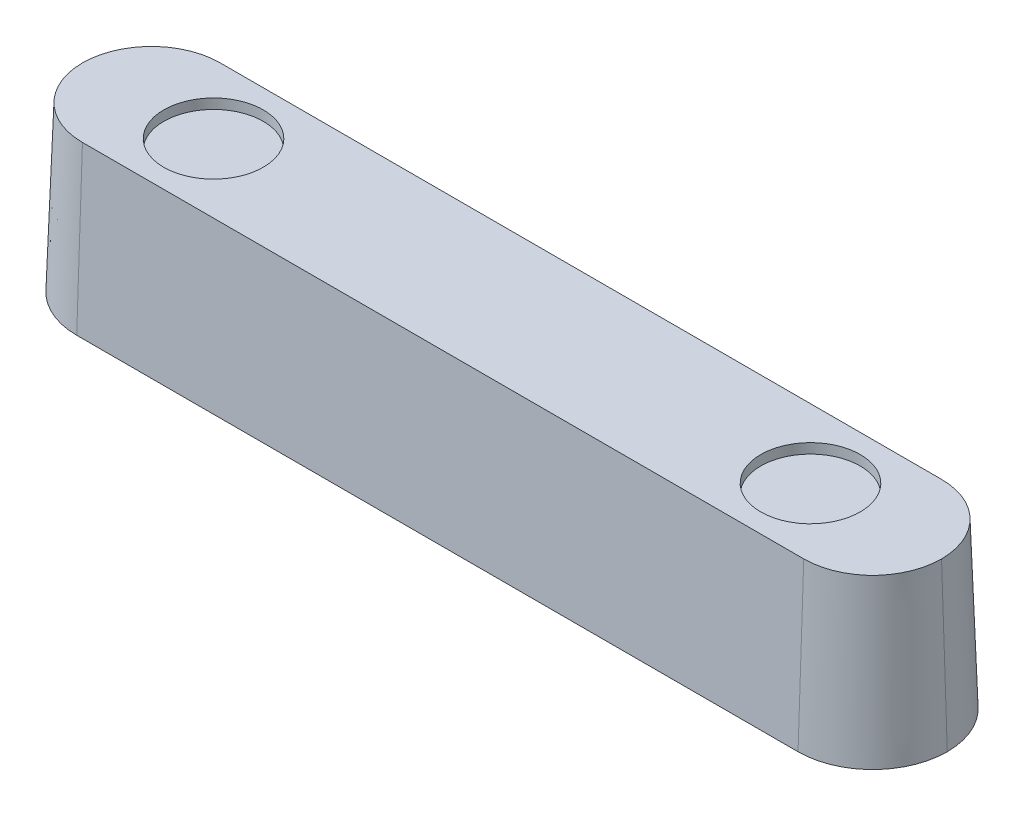
ISO-10303-21;
HEADER;
FILE_DESCRIPTION(('STEP AP214'),'2;1');
FILE_NAME('part.step','',(''),(''),'','','');
FILE_SCHEMA(('AUTOMOTIVE_DESIGN { 1 0 10303 214 1 1 1 1 }'));
ENDSEC;
DATA;
#1=APPLICATION_CONTEXT('core data for automotive mechanical design processes');
#2=APPLICATION_PROTOCOL_DEFINITION('international standard','automotive_design',2000,#1);
#3=PRODUCT_CONTEXT('',#1,'mechanical');
#4=PRODUCT('Part','Part','',(#3));
#5=PRODUCT_RELATED_PRODUCT_CATEGORY('part','',(#4));
#6=PRODUCT_DEFINITION_FORMATION('','',#4);
#7=PRODUCT_DEFINITION_CONTEXT('part definition',#1,'design');
#8=PRODUCT_DEFINITION('design','',#6,#7);
#9=PRODUCT_DEFINITION_SHAPE('','',#8);
#10=(LENGTH_UNIT() NAMED_UNIT(*) SI_UNIT(.MILLI.,.METRE.));
#11=(NAMED_UNIT(*) PLANE_ANGLE_UNIT() SI_UNIT($,.RADIAN.));
#12=(NAMED_UNIT(*) SI_UNIT($,.STERADIAN.) SOLID_ANGLE_UNIT());
#13=UNCERTAINTY_MEASURE_WITH_UNIT(LENGTH_MEASURE(1.E-05),#10,'distance_accuracy_value','');
#14=(GEOMETRIC_REPRESENTATION_CONTEXT(3) GLOBAL_UNCERTAINTY_ASSIGNED_CONTEXT((#13)) GLOBAL_UNIT_ASSIGNED_CONTEXT((#10,
#11,#12)) REPRESENTATION_CONTEXT('',''));
#15=CARTESIAN_POINT('',(0.,0.,0.));
#16=DIRECTION('',(0.,0.,1.));
#17=DIRECTION('',(1.,0.,0.));
#18=AXIS2_PLACEMENT_3D('',#15,#16,#17);
#19=CARTESIAN_POINT('',(-87.5,0.,-15.));
#20=DIRECTION('',(0.,0.034899496702501,-0.999390827019096));
#21=DIRECTION('',(0.,0.999390827019096,0.034899496702501));
#22=AXIS2_PLACEMENT_3D('',#19,#20,#21);
#23=PLANE('',#22);
#24=CARTESIAN_POINT('',(0.,17.1,-14.4028548416911));
#25=DIRECTION('',(0.,0.034899496702501,-0.999390827019096));
#26=DIRECTION('',(0.,-0.999390827019096,-0.034899496702501));
#27=AXIS2_PLACEMENT_3D('',#24,#25,#26);
#28=ELLIPSE('',#27,4.00243817719529,4.);
#29=CARTESIAN_POINT('',(0.,13.1,-14.5425379196581));
#30=VERTEX_POINT('',#29);
#31=EDGE_CURVE('E134',#30,#30,#28,.T.);
#32=ORIENTED_EDGE('',*,*,#31,.F.);
#33=EDGE_LOOP('',(#32));
#34=FACE_BOUND('',#33,.T.);
#35=DIRECTION('',(1.,0.,0.));
#36=VECTOR('',#35,1.);
#37=CARTESIAN_POINT('',(0.,33.,-13.8476146067723));
#38=LINE('',#37,#36);
#39=CARTESIAN_POINT('',(72.5,33.,-13.8476146067723));
#40=VERTEX_POINT('',#39);
#41=CARTESIAN_POINT('',(-72.5,33.,-13.8476146067723));
#42=VERTEX_POINT('',#41);
#43=EDGE_CURVE('E125',#40,#42,#38,.F.);
#44=ORIENTED_EDGE('',*,*,#43,.F.);
#45=DIRECTION('',(0.,-0.999390827019096,-0.034899496702501));
#46=VECTOR('',#45,1.);
#47=CARTESIAN_POINT('',(72.5,0.,-15.));
#48=LINE('',#47,#46);
#49=CARTESIAN_POINT('',(72.5,0.,-15.));
#50=VERTEX_POINT('',#49);
#51=EDGE_CURVE('E11',#40,#50,#48,.T.);
#52=ORIENTED_EDGE('',*,*,#51,.T.);
#53=DIRECTION('',(-1.,0.,0.));
#54=VECTOR('',#53,1.);
#55=CARTESIAN_POINT('',(-87.5,0.,-15.));
#56=LINE('',#55,#54);
#57=CARTESIAN_POINT('',(-72.5,0.,-15.));
#58=VERTEX_POINT('',#57);
#59=EDGE_CURVE('E95',#50,#58,#56,.T.);
#60=ORIENTED_EDGE('',*,*,#59,.T.);
#61=DIRECTION('',(0.,-0.999390827019096,-0.034899496702501));
#62=VECTOR('',#61,1.);
#63=CARTESIAN_POINT('',(-72.5,0.,-15.));
#64=LINE('',#63,#62);
#65=EDGE_CURVE('E41',#58,#42,#64,.F.);
#66=ORIENTED_EDGE('',*,*,#65,.T.);
#67=EDGE_LOOP('',(#44,#52,#60,#66));
#68=FACE_BOUND('',#67,.T.);
#69=ADVANCED_FACE('F37',(#34,#68),#23,.T.);
#70=CARTESIAN_POINT('',(-87.5,0.,15.));
#71=DIRECTION('',(0.,0.034899496702501,0.999390827019096));
#72=DIRECTION('',(0.,-0.999390827019096,0.034899496702501));
#73=AXIS2_PLACEMENT_3D('',#70,#71,#72);
#74=PLANE('',#73);
#75=DIRECTION('',(1.,0.,0.));
#76=VECTOR('',#75,1.);
#77=CARTESIAN_POINT('',(-87.5,0.,15.));
#78=LINE('',#77,#76);
#79=CARTESIAN_POINT('',(-72.5,0.,15.));
#80=VERTEX_POINT('',#79);
#81=CARTESIAN_POINT('',(72.5,0.,15.));
#82=VERTEX_POINT('',#81);
#83=EDGE_CURVE('E131',#80,#82,#78,.T.);
#84=ORIENTED_EDGE('',*,*,#83,.T.);
#85=DIRECTION('',(0.,-0.999390827019096,0.034899496702501));
#86=VECTOR('',#85,1.);
#87=CARTESIAN_POINT('',(72.5,0.,15.));
#88=LINE('',#87,#86);
#89=CARTESIAN_POINT('',(72.5,33.,13.8476146067723));
#90=VERTEX_POINT('',#89);
#91=EDGE_CURVE('E111',#82,#90,#88,.F.);
#92=ORIENTED_EDGE('',*,*,#91,.T.);
#93=DIRECTION('',(-1.,0.,0.));
#94=VECTOR('',#93,1.);
#95=CARTESIAN_POINT('',(0.,33.,13.8476146067723));
#96=LINE('',#95,#94);
#97=CARTESIAN_POINT('',(-72.5,33.,13.8476146067723));
#98=VERTEX_POINT('',#97);
#99=EDGE_CURVE('E121',#98,#90,#96,.F.);
#100=ORIENTED_EDGE('',*,*,#99,.F.);
#101=DIRECTION('',(0.,-0.999390827019096,0.034899496702501));
#102=VECTOR('',#101,1.);
#103=CARTESIAN_POINT('',(-72.5,0.,15.));
#104=LINE('',#103,#102);
#105=EDGE_CURVE('E112',#98,#80,#104,.T.);
#106=ORIENTED_EDGE('',*,*,#105,.T.);
#107=EDGE_LOOP('',(#84,#92,#100,#106));
#108=FACE_BOUND('',#107,.T.);
#109=ADVANCED_FACE('F139',(#108),#74,.T.);
#110=CARTESIAN_POINT('',(0.,33.,0.));
#111=DIRECTION('',(0.,-1.,0.));
#112=DIRECTION('',(0.,0.,-1.));
#113=AXIS2_PLACEMENT_3D('',#110,#111,#112);
#114=PLANE('',#113);
#115=CARTESIAN_POINT('',(-60.,33.,0.));
#116=DIRECTION('',(0.,1.,0.));
#117=DIRECTION('',(0.,0.,1.));
#118=AXIS2_PLACEMENT_3D('',#115,#116,#117);
#119=CIRCLE('',#118,10.);
#120=CARTESIAN_POINT('',(-60.,33.,10.));
#121=VERTEX_POINT('',#120);
#122=EDGE_CURVE('E208',#121,#121,#119,.T.);
#123=ORIENTED_EDGE('',*,*,#122,.F.);
#124=EDGE_LOOP('',(#123));
#125=FACE_BOUND('',#124,.T.);
#126=CARTESIAN_POINT('',(60.,33.,0.));
#127=DIRECTION('',(0.,1.,0.));
#128=DIRECTION('',(0.,0.,1.));
#129=AXIS2_PLACEMENT_3D('',#126,#127,#128);
#130=CIRCLE('',#129,9.99999999999999);
#131=CARTESIAN_POINT('',(60.,33.,9.99999999999997));
#132=VERTEX_POINT('',#131);
#133=EDGE_CURVE('E106',#132,#132,#130,.T.);
#134=ORIENTED_EDGE('',*,*,#133,.F.);
#135=EDGE_LOOP('',(#134));
#136=FACE_BOUND('',#135,.T.);
#137=ORIENTED_EDGE('',*,*,#99,.T.);
#138=CARTESIAN_POINT('',(72.5,33.,0.));
#139=DIRECTION('',(0.,-1.,0.));
#140=DIRECTION('',(0.,0.,-1.));
#141=AXIS2_PLACEMENT_3D('',#138,#139,#140);
#142=CIRCLE('',#141,13.8476146067723);
#143=CARTESIAN_POINT('',(86.3476146067723,33.,0.));
#144=VERTEX_POINT('',#143);
#145=EDGE_CURVE('E126',#90,#144,#142,.F.);
#146=ORIENTED_EDGE('',*,*,#145,.T.);
#147=CARTESIAN_POINT('',(72.5,33.,0.));
#148=DIRECTION('',(0.,-1.,0.));
#149=DIRECTION('',(0.,0.,-1.));
#150=AXIS2_PLACEMENT_3D('',#147,#148,#149);
#151=CIRCLE('',#150,13.8476146067723);
#152=EDGE_CURVE('E104',#144,#40,#151,.F.);
#153=ORIENTED_EDGE('',*,*,#152,.T.);
#154=ORIENTED_EDGE('',*,*,#43,.T.);
#155=CARTESIAN_POINT('',(-72.5,33.,0.));
#156=DIRECTION('',(0.,-1.,0.));
#157=DIRECTION('',(0.,0.,-1.));
#158=AXIS2_PLACEMENT_3D('',#155,#156,#157);
#159=CIRCLE('',#158,13.8476146067723);
#160=CARTESIAN_POINT('',(-86.3476146067723,33.,0.));
#161=VERTEX_POINT('',#160);
#162=EDGE_CURVE('E54',#42,#161,#159,.F.);
#163=ORIENTED_EDGE('',*,*,#162,.T.);
#164=CARTESIAN_POINT('',(-72.5,33.,0.));
#165=DIRECTION('',(0.,-1.,0.));
#166=DIRECTION('',(0.,0.,-1.));
#167=AXIS2_PLACEMENT_3D('',#164,#165,#166);
#168=CIRCLE('',#167,13.8476146067723);
#169=EDGE_CURVE('E129',#161,#98,#168,.F.);
#170=ORIENTED_EDGE('',*,*,#169,.T.);
#171=EDGE_LOOP('',(#137,#146,#153,#154,#163,#170));
#172=FACE_BOUND('',#171,.T.);
#173=ADVANCED_FACE('F141',(#125,#136,#172),#114,.F.);
#174=CARTESIAN_POINT('',(0.,0.,0.));
#175=DIRECTION('',(0.,-1.,0.));
#176=DIRECTION('',(0.,0.,-1.));
#177=AXIS2_PLACEMENT_3D('',#174,#175,#176);
#178=PLANE('',#177);
#179=CARTESIAN_POINT('',(72.5,0.,0.));
#180=DIRECTION('',(0.,-1.,0.));
#181=DIRECTION('',(0.,0.,-1.));
#182=AXIS2_PLACEMENT_3D('',#179,#180,#181);
#183=CIRCLE('',#182,15.);
#184=CARTESIAN_POINT('',(87.5,0.,0.));
#185=VERTEX_POINT('',#184);
#186=EDGE_CURVE('E87',#50,#185,#183,.T.);
#187=ORIENTED_EDGE('',*,*,#186,.T.);
#188=CARTESIAN_POINT('',(72.5,0.,0.));
#189=DIRECTION('',(0.,-1.,0.));
#190=DIRECTION('',(0.,0.,-1.));
#191=AXIS2_PLACEMENT_3D('',#188,#189,#190);
#192=CIRCLE('',#191,15.);
#193=EDGE_CURVE('E92',#185,#82,#192,.T.);
#194=ORIENTED_EDGE('',*,*,#193,.T.);
#195=ORIENTED_EDGE('',*,*,#83,.F.);
#196=CARTESIAN_POINT('',(-72.5,0.,0.));
#197=DIRECTION('',(0.,-1.,0.));
#198=DIRECTION('',(0.,0.,-1.));
#199=AXIS2_PLACEMENT_3D('',#196,#197,#198);
#200=CIRCLE('',#199,15.);
#201=CARTESIAN_POINT('',(-87.5,0.,0.));
#202=VERTEX_POINT('',#201);
#203=EDGE_CURVE('E98',#80,#202,#200,.T.);
#204=ORIENTED_EDGE('',*,*,#203,.T.);
#205=CARTESIAN_POINT('',(-72.5,0.,0.));
#206=DIRECTION('',(0.,-1.,0.));
#207=DIRECTION('',(0.,0.,-1.));
#208=AXIS2_PLACEMENT_3D('',#205,#206,#207);
#209=CIRCLE('',#208,15.);
#210=EDGE_CURVE('E124',#202,#58,#209,.T.);
#211=ORIENTED_EDGE('',*,*,#210,.T.);
#212=ORIENTED_EDGE('',*,*,#59,.F.);
#213=EDGE_LOOP('',(#187,#194,#195,#204,#211,#212));
#214=FACE_BOUND('',#213,.T.);
#215=ADVANCED_FACE('F89',(#214),#178,.T.);
#216=CARTESIAN_POINT('',(60.,31.,0.));
#217=DIRECTION('',(0.,1.,0.));
#218=DIRECTION('',(0.,0.,1.));
#219=AXIS2_PLACEMENT_3D('',#216,#217,#218);
#220=CYLINDRICAL_SURFACE('',#219,9.99999999999999);
#221=CARTESIAN_POINT('',(60.,31.,0.));
#222=DIRECTION('',(0.,1.,0.));
#223=DIRECTION('',(0.,0.,1.));
#224=AXIS2_PLACEMENT_3D('',#221,#222,#223);
#225=CIRCLE('',#224,9.99999999999999);
#226=CARTESIAN_POINT('',(60.,31.,9.99999999999997));
#227=VERTEX_POINT('',#226);
#228=EDGE_CURVE('E211',#227,#227,#225,.T.);
#229=ORIENTED_EDGE('',*,*,#228,.F.);
#230=EDGE_LOOP('',(#229));
#231=FACE_BOUND('',#230,.T.);
#232=ORIENTED_EDGE('',*,*,#133,.T.);
#233=EDGE_LOOP('',(#232));
#234=FACE_BOUND('',#233,.T.);
#235=ADVANCED_FACE('F176',(#231,#234),#220,.F.);
#236=CARTESIAN_POINT('',(60.,31.,0.));
#237=DIRECTION('',(0.,1.,0.));
#238=DIRECTION('',(0.,0.,1.));
#239=AXIS2_PLACEMENT_3D('',#236,#237,#238);
#240=PLANE('',#239);
#241=ORIENTED_EDGE('',*,*,#228,.T.);
#242=EDGE_LOOP('',(#241));
#243=FACE_BOUND('',#242,.T.);
#244=ADVANCED_FACE('F182',(#243),#240,.T.);
#245=CARTESIAN_POINT('',(-60.,31.,0.));
#246=DIRECTION('',(0.,1.,0.));
#247=DIRECTION('',(0.,0.,1.));
#248=AXIS2_PLACEMENT_3D('',#245,#246,#247);
#249=CYLINDRICAL_SURFACE('',#248,10.);
#250=CARTESIAN_POINT('',(-60.,31.,0.));
#251=DIRECTION('',(0.,1.,0.));
#252=DIRECTION('',(0.,0.,1.));
#253=AXIS2_PLACEMENT_3D('',#250,#251,#252);
#254=CIRCLE('',#253,10.);
#255=CARTESIAN_POINT('',(-60.,31.,10.));
#256=VERTEX_POINT('',#255);
#257=EDGE_CURVE('E147',#256,#256,#254,.T.);
#258=ORIENTED_EDGE('',*,*,#257,.F.);
#259=EDGE_LOOP('',(#258));
#260=FACE_BOUND('',#259,.T.);
#261=ORIENTED_EDGE('',*,*,#122,.T.);
#262=EDGE_LOOP('',(#261));
#263=FACE_BOUND('',#262,.T.);
#264=ADVANCED_FACE('F186',(#260,#263),#249,.F.);
#265=CARTESIAN_POINT('',(-60.,31.,0.));
#266=DIRECTION('',(0.,1.,0.));
#267=DIRECTION('',(0.,0.,1.));
#268=AXIS2_PLACEMENT_3D('',#265,#266,#267);
#269=PLANE('',#268);
#270=ORIENTED_EDGE('',*,*,#257,.T.);
#271=EDGE_LOOP('',(#270));
#272=FACE_BOUND('',#271,.T.);
#273=ADVANCED_FACE('F172',(#272),#269,.T.);
#274=CARTESIAN_POINT('',(72.5,0.,0.));
#275=DIRECTION('',(0.,-1.,0.));
#276=DIRECTION('',(0.,0.,-1.));
#277=AXIS2_PLACEMENT_3D('',#274,#275,#276);
#278=CONICAL_SURFACE('',#277,15.,0.0349065850398867);
#279=ORIENTED_EDGE('',*,*,#51,.F.);
#280=ORIENTED_EDGE('',*,*,#152,.F.);
#281=DIRECTION('',(0.034899496702501,-0.999390827019096,0.));
#282=VECTOR('',#281,1.);
#283=CARTESIAN_POINT('',(87.5,0.,0.));
#284=LINE('',#283,#282);
#285=EDGE_CURVE('E102',#185,#144,#284,.F.);
#286=ORIENTED_EDGE('',*,*,#285,.F.);
#287=ORIENTED_EDGE('',*,*,#186,.F.);
#288=EDGE_LOOP('',(#279,#280,#286,#287));
#289=FACE_BOUND('',#288,.T.);
#290=ADVANCED_FACE('F103',(#289),#278,.T.);
#291=CARTESIAN_POINT('',(72.5,0.,0.));
#292=DIRECTION('',(0.,-1.,0.));
#293=DIRECTION('',(0.,0.,-1.));
#294=AXIS2_PLACEMENT_3D('',#291,#292,#293);
#295=CONICAL_SURFACE('',#294,15.,0.0349065850398867);
#296=ORIENTED_EDGE('',*,*,#145,.F.);
#297=ORIENTED_EDGE('',*,*,#91,.F.);
#298=ORIENTED_EDGE('',*,*,#193,.F.);
#299=ORIENTED_EDGE('',*,*,#285,.T.);
#300=EDGE_LOOP('',(#296,#297,#298,#299));
#301=FACE_BOUND('',#300,.T.);
#302=ADVANCED_FACE('F109',(#301),#295,.T.);
#303=CARTESIAN_POINT('',(-72.5,0.,0.));
#304=DIRECTION('',(0.,-1.,0.));
#305=DIRECTION('',(0.,0.,-1.));
#306=AXIS2_PLACEMENT_3D('',#303,#304,#305);
#307=CONICAL_SURFACE('',#306,15.,0.0349065850398867);
#308=DIRECTION('',(-0.034899496702501,-0.999390827019096,0.));
#309=VECTOR('',#308,1.);
#310=CARTESIAN_POINT('',(-87.5,0.,0.));
#311=LINE('',#310,#309);
#312=EDGE_CURVE('E107',#161,#202,#311,.T.);
#313=ORIENTED_EDGE('',*,*,#312,.F.);
#314=ORIENTED_EDGE('',*,*,#162,.F.);
#315=ORIENTED_EDGE('',*,*,#65,.F.);
#316=ORIENTED_EDGE('',*,*,#210,.F.);
#317=EDGE_LOOP('',(#313,#314,#315,#316));
#318=FACE_BOUND('',#317,.T.);
#319=ADVANCED_FACE('F39',(#318),#307,.T.);
#320=CARTESIAN_POINT('',(-72.5,0.,0.));
#321=DIRECTION('',(0.,-1.,0.));
#322=DIRECTION('',(0.,0.,-1.));
#323=AXIS2_PLACEMENT_3D('',#320,#321,#322);
#324=CONICAL_SURFACE('',#323,15.,0.0349065850398867);
#325=ORIENTED_EDGE('',*,*,#169,.F.);
#326=ORIENTED_EDGE('',*,*,#312,.T.);
#327=ORIENTED_EDGE('',*,*,#203,.F.);
#328=ORIENTED_EDGE('',*,*,#105,.F.);
#329=EDGE_LOOP('',(#325,#326,#327,#328));
#330=FACE_BOUND('',#329,.T.);
#331=ADVANCED_FACE('F144',(#330),#324,.T.);
#332=CARTESIAN_POINT('',(0.,17.1,-11.));
#333=DIRECTION('',(0.,0.,-1.));
#334=DIRECTION('',(-1.,0.,0.));
#335=AXIS2_PLACEMENT_3D('',#332,#333,#334);
#336=CYLINDRICAL_SURFACE('',#335,4.);
#337=CARTESIAN_POINT('',(0.,17.1,-11.));
#338=DIRECTION('',(0.,0.,-1.));
#339=DIRECTION('',(-1.,0.,0.));
#340=AXIS2_PLACEMENT_3D('',#337,#338,#339);
#341=CIRCLE('',#340,4.);
#342=CARTESIAN_POINT('',(-4.,17.1,-11.));
#343=VERTEX_POINT('',#342);
#344=EDGE_CURVE('E120',#343,#343,#341,.T.);
#345=ORIENTED_EDGE('',*,*,#344,.F.);
#346=EDGE_LOOP('',(#345));
#347=FACE_BOUND('',#346,.T.);
#348=ORIENTED_EDGE('',*,*,#31,.T.);
#349=EDGE_LOOP('',(#348));
#350=FACE_BOUND('',#349,.T.);
#351=ADVANCED_FACE('F160',(#347,#350),#336,.F.);
#352=CARTESIAN_POINT('',(0.,17.1,-11.));
#353=DIRECTION('',(0.,0.,-1.));
#354=DIRECTION('',(-1.,0.,0.));
#355=AXIS2_PLACEMENT_3D('',#352,#353,#354);
#356=PLANE('',#355);
#357=ORIENTED_EDGE('',*,*,#344,.T.);
#358=EDGE_LOOP('',(#357));
#359=FACE_BOUND('',#358,.T.);
#360=ADVANCED_FACE('F196',(#359),#356,.T.);
#361=CLOSED_SHELL('',(#69,#109,#173,#215,#235,#244,#264,#273,#290,#302,#319,#331,#351,#360));
#362=MANIFOLD_SOLID_BREP('B2',#361);
#363=ADVANCED_BREP_SHAPE_REPRESENTATION('',(#18,#362),#14);
#364=SHAPE_DEFINITION_REPRESENTATION(#9,#363);
ENDSEC;
END-ISO-10303-21;
